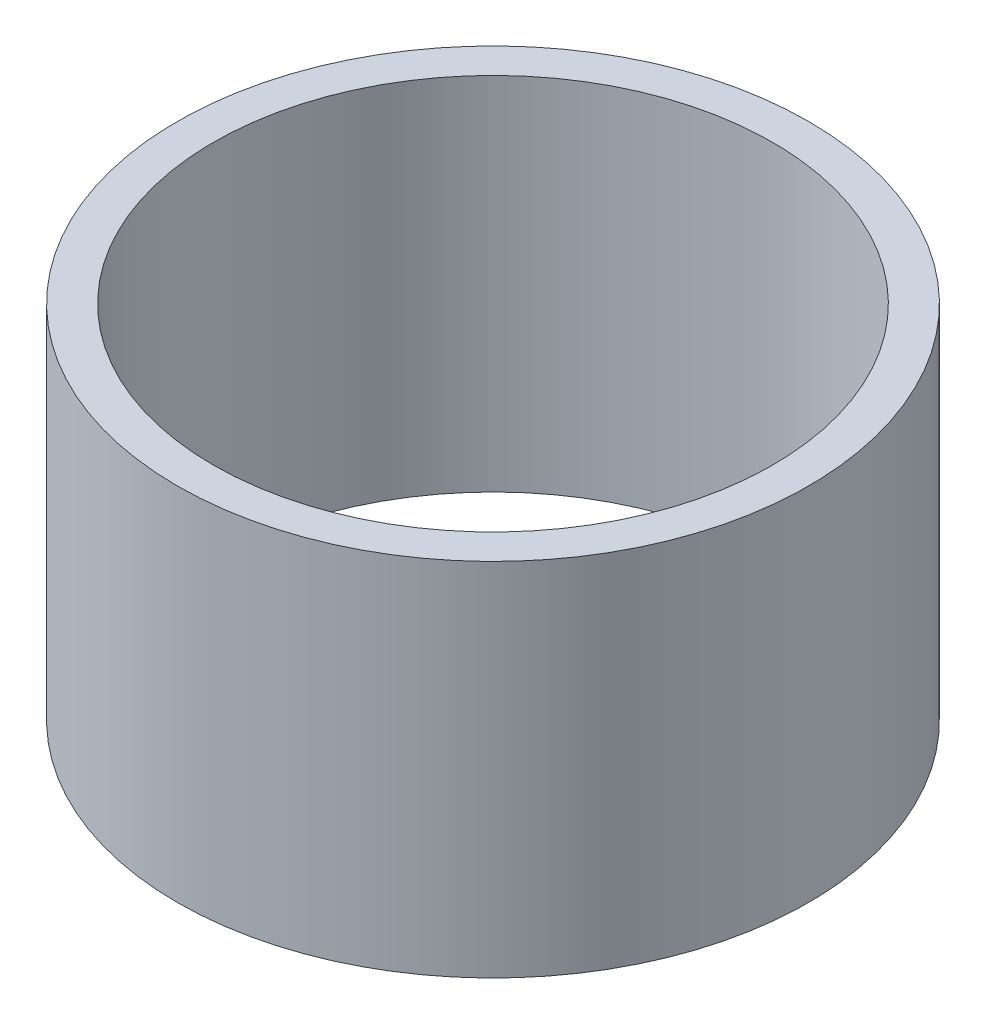
ISO-10303-21;
HEADER;
FILE_DESCRIPTION(('STEP AP214'),'2;1');
FILE_NAME('part.step','',(''),(''),'','','');
FILE_SCHEMA(('AUTOMOTIVE_DESIGN { 1 0 10303 214 1 1 1 1 }'));
ENDSEC;
DATA;
#1=APPLICATION_CONTEXT('core data for automotive mechanical design processes');
#2=APPLICATION_PROTOCOL_DEFINITION('international standard','automotive_design',2000,#1);
#3=PRODUCT_CONTEXT('',#1,'mechanical');
#4=PRODUCT('Part','Part','',(#3));
#5=PRODUCT_RELATED_PRODUCT_CATEGORY('part','',(#4));
#6=PRODUCT_DEFINITION_FORMATION('','',#4);
#7=PRODUCT_DEFINITION_CONTEXT('part definition',#1,'design');
#8=PRODUCT_DEFINITION('design','',#6,#7);
#9=PRODUCT_DEFINITION_SHAPE('','',#8);
#10=(LENGTH_UNIT() NAMED_UNIT(*) SI_UNIT(.MILLI.,.METRE.));
#11=(NAMED_UNIT(*) PLANE_ANGLE_UNIT() SI_UNIT($,.RADIAN.));
#12=(NAMED_UNIT(*) SI_UNIT($,.STERADIAN.) SOLID_ANGLE_UNIT());
#13=UNCERTAINTY_MEASURE_WITH_UNIT(LENGTH_MEASURE(1.E-05),#10,'distance_accuracy_value','');
#14=(GEOMETRIC_REPRESENTATION_CONTEXT(3) GLOBAL_UNCERTAINTY_ASSIGNED_CONTEXT((#13)) GLOBAL_UNIT_ASSIGNED_CONTEXT((#10,
#11,#12)) REPRESENTATION_CONTEXT('',''));
#15=CARTESIAN_POINT('',(0.,0.,0.));
#16=DIRECTION('',(0.,0.,1.));
#17=DIRECTION('',(1.,0.,0.));
#18=AXIS2_PLACEMENT_3D('',#15,#16,#17);
#19=CARTESIAN_POINT('',(0.,4.,0.));
#20=DIRECTION('',(0.,1.,0.));
#21=DIRECTION('',(0.,0.,1.));
#22=AXIS2_PLACEMENT_3D('',#19,#20,#21);
#23=PLANE('',#22);
#24=CARTESIAN_POINT('',(0.,4.,0.));
#25=DIRECTION('',(0.,1.,0.));
#26=DIRECTION('',(0.,0.,1.));
#27=AXIS2_PLACEMENT_3D('',#24,#25,#26);
#28=CIRCLE('',#27,3.5);
#29=CARTESIAN_POINT('',(0.,4.,3.5));
#30=VERTEX_POINT('',#29);
#31=EDGE_CURVE('E10',#30,#30,#28,.T.);
#32=ORIENTED_EDGE('',*,*,#31,.T.);
#33=EDGE_LOOP('',(#32));
#34=FACE_BOUND('',#33,.T.);
#35=CARTESIAN_POINT('',(0.,4.,0.));
#36=DIRECTION('',(0.,1.,0.));
#37=DIRECTION('',(0.,0.,1.));
#38=AXIS2_PLACEMENT_3D('',#35,#36,#37);
#39=CIRCLE('',#38,3.1);
#40=CARTESIAN_POINT('',(0.,4.,3.1));
#41=VERTEX_POINT('',#40);
#42=EDGE_CURVE('E56',#41,#41,#39,.T.);
#43=ORIENTED_EDGE('',*,*,#42,.F.);
#44=EDGE_LOOP('',(#43));
#45=FACE_BOUND('',#44,.T.);
#46=ADVANCED_FACE('F43',(#34,#45),#23,.T.);
#47=CARTESIAN_POINT('',(0.,0.,0.));
#48=DIRECTION('',(0.,1.,0.));
#49=DIRECTION('',(0.,0.,1.));
#50=AXIS2_PLACEMENT_3D('',#47,#48,#49);
#51=PLANE('',#50);
#52=CARTESIAN_POINT('',(0.,0.,0.));
#53=DIRECTION('',(0.,1.,0.));
#54=DIRECTION('',(0.,0.,1.));
#55=AXIS2_PLACEMENT_3D('',#52,#53,#54);
#56=CIRCLE('',#55,3.5);
#57=CARTESIAN_POINT('',(0.,0.,3.5));
#58=VERTEX_POINT('',#57);
#59=EDGE_CURVE('E47',#58,#58,#56,.T.);
#60=ORIENTED_EDGE('',*,*,#59,.F.);
#61=EDGE_LOOP('',(#60));
#62=FACE_BOUND('',#61,.T.);
#63=CARTESIAN_POINT('',(0.,0.,0.));
#64=DIRECTION('',(0.,1.,0.));
#65=DIRECTION('',(0.,0.,1.));
#66=AXIS2_PLACEMENT_3D('',#63,#64,#65);
#67=CIRCLE('',#66,3.1);
#68=CARTESIAN_POINT('',(0.,0.,3.1));
#69=VERTEX_POINT('',#68);
#70=EDGE_CURVE('E58',#69,#69,#67,.T.);
#71=ORIENTED_EDGE('',*,*,#70,.T.);
#72=EDGE_LOOP('',(#71));
#73=FACE_BOUND('',#72,.T.);
#74=ADVANCED_FACE('F70',(#62,#73),#51,.F.);
#75=CARTESIAN_POINT('',(0.,4.,0.));
#76=DIRECTION('',(0.,-1.,0.));
#77=DIRECTION('',(0.,0.,-1.));
#78=AXIS2_PLACEMENT_3D('',#75,#76,#77);
#79=CYLINDRICAL_SURFACE('',#78,3.5);
#80=ORIENTED_EDGE('',*,*,#31,.F.);
#81=EDGE_LOOP('',(#80));
#82=FACE_BOUND('',#81,.T.);
#83=ORIENTED_EDGE('',*,*,#59,.T.);
#84=EDGE_LOOP('',(#83));
#85=FACE_BOUND('',#84,.T.);
#86=ADVANCED_FACE('F45',(#82,#85),#79,.T.);
#87=CARTESIAN_POINT('',(0.,4.,0.));
#88=DIRECTION('',(0.,-1.,0.));
#89=DIRECTION('',(0.,0.,-1.));
#90=AXIS2_PLACEMENT_3D('',#87,#88,#89);
#91=CYLINDRICAL_SURFACE('',#90,3.1);
#92=ORIENTED_EDGE('',*,*,#42,.T.);
#93=EDGE_LOOP('',(#92));
#94=FACE_BOUND('',#93,.T.);
#95=ORIENTED_EDGE('',*,*,#70,.F.);
#96=EDGE_LOOP('',(#95));
#97=FACE_BOUND('',#96,.T.);
#98=ADVANCED_FACE('F66',(#94,#97),#91,.F.);
#99=CLOSED_SHELL('',(#46,#74,#86,#98));
#100=MANIFOLD_SOLID_BREP('B2',#99);
#101=ADVANCED_BREP_SHAPE_REPRESENTATION('',(#18,#100),#14);
#102=SHAPE_DEFINITION_REPRESENTATION(#9,#101);
ENDSEC;
END-ISO-10303-21;
